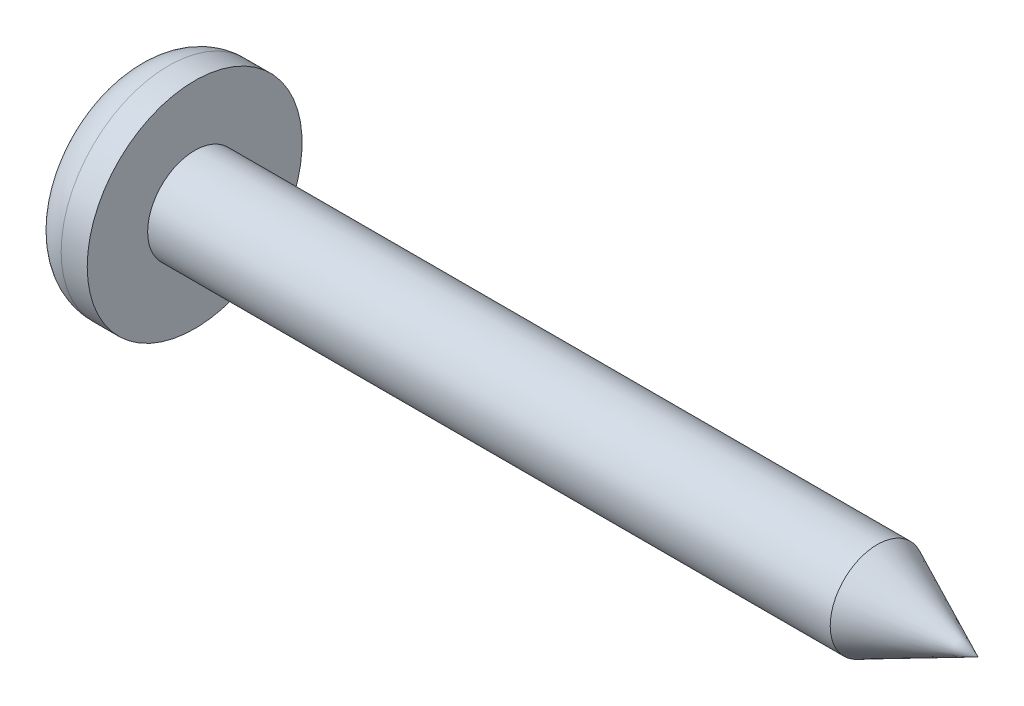
ISO-10303-21;
HEADER;
FILE_DESCRIPTION(('STEP AP214'),'2;1');
FILE_NAME('part.step','',(''),(''),'','','');
FILE_SCHEMA(('AUTOMOTIVE_DESIGN { 1 0 10303 214 1 1 1 1 }'));
ENDSEC;
DATA;
#1=APPLICATION_CONTEXT('core data for automotive mechanical design processes');
#2=APPLICATION_PROTOCOL_DEFINITION('international standard','automotive_design',2000,#1);
#3=PRODUCT_CONTEXT('',#1,'mechanical');
#4=PRODUCT('Part','Part','',(#3));
#5=PRODUCT_RELATED_PRODUCT_CATEGORY('part','',(#4));
#6=PRODUCT_DEFINITION_FORMATION('','',#4);
#7=PRODUCT_DEFINITION_CONTEXT('part definition',#1,'design');
#8=PRODUCT_DEFINITION('design','',#6,#7);
#9=PRODUCT_DEFINITION_SHAPE('','',#8);
#10=(LENGTH_UNIT() NAMED_UNIT(*) SI_UNIT(.MILLI.,.METRE.));
#11=(NAMED_UNIT(*) PLANE_ANGLE_UNIT() SI_UNIT($,.RADIAN.));
#12=(NAMED_UNIT(*) SI_UNIT($,.STERADIAN.) SOLID_ANGLE_UNIT());
#13=UNCERTAINTY_MEASURE_WITH_UNIT(LENGTH_MEASURE(1.E-05),#10,'distance_accuracy_value','');
#14=(GEOMETRIC_REPRESENTATION_CONTEXT(3) GLOBAL_UNCERTAINTY_ASSIGNED_CONTEXT((#13)) GLOBAL_UNIT_ASSIGNED_CONTEXT((#10,
#11,#12)) REPRESENTATION_CONTEXT('',''));
#15=CARTESIAN_POINT('',(0.,0.,0.));
#16=DIRECTION('',(0.,0.,1.));
#17=DIRECTION('',(1.,0.,0.));
#18=AXIS2_PLACEMENT_3D('',#15,#16,#17);
#19=CARTESIAN_POINT('',(0.,0.,0.));
#20=DIRECTION('',(-1.,0.,0.));
#21=DIRECTION('',(0.,0.,1.));
#22=AXIS2_PLACEMENT_3D('',#19,#20,#21);
#23=CYLINDRICAL_SURFACE('',#22,1.5);
#24=CARTESIAN_POINT('',(2.,0.,0.));
#25=DIRECTION('',(-1.,0.,0.));
#26=DIRECTION('',(0.,0.,1.));
#27=AXIS2_PLACEMENT_3D('',#24,#25,#26);
#28=CIRCLE('',#27,1.5);
#29=CARTESIAN_POINT('',(2.,0.,1.5));
#30=VERTEX_POINT('',#29);
#31=EDGE_CURVE('E255',#30,#30,#28,.T.);
#32=ORIENTED_EDGE('',*,*,#31,.F.);
#33=EDGE_LOOP('',(#32));
#34=FACE_BOUND('',#33,.T.);
#35=CARTESIAN_POINT('',(23.7832396192356,0.,0.));
#36=DIRECTION('',(-1.,0.,0.));
#37=DIRECTION('',(0.,0.,1.));
#38=AXIS2_PLACEMENT_3D('',#35,#36,#37);
#39=CIRCLE('',#38,1.5);
#40=CARTESIAN_POINT('',(23.7832396192356,0.,1.5));
#41=VERTEX_POINT('',#40);
#42=EDGE_CURVE('E196',#41,#41,#39,.T.);
#43=ORIENTED_EDGE('',*,*,#42,.T.);
#44=EDGE_LOOP('',(#43));
#45=FACE_BOUND('',#44,.T.);
#46=ADVANCED_FACE('F74',(#34,#45),#23,.T.);
#47=CARTESIAN_POINT('',(0.,0.,0.));
#48=DIRECTION('',(1.,0.,0.));
#49=DIRECTION('',(0.,0.,-1.));
#50=AXIS2_PLACEMENT_3D('',#47,#48,#49);
#51=PLANE('',#50);
#52=CARTESIAN_POINT('',(0.,0.,0.));
#53=DIRECTION('',(-1.,0.,0.));
#54=DIRECTION('',(0.,0.,1.));
#55=AXIS2_PLACEMENT_3D('',#52,#53,#54);
#56=CIRCLE('',#55,2.2606);
#57=CARTESIAN_POINT('',(0.,0.,2.2606));
#58=VERTEX_POINT('',#57);
#59=EDGE_CURVE('E47',#58,#58,#56,.T.);
#60=ORIENTED_EDGE('',*,*,#59,.T.);
#61=EDGE_LOOP('',(#60));
#62=FACE_BOUND('',#61,.T.);
#63=DIRECTION('',(0.,0.,-1.));
#64=VECTOR('',#63,1.);
#65=CARTESIAN_POINT('',(0.,-0.3556,0.3556));
#66=LINE('',#65,#64);
#67=CARTESIAN_POINT('',(0.,-0.3556,2.032));
#68=VERTEX_POINT('',#67);
#69=CARTESIAN_POINT('',(0.,-0.3556,0.762));
#70=VERTEX_POINT('',#69);
#71=EDGE_CURVE('E268',#68,#70,#66,.T.);
#72=ORIENTED_EDGE('',*,*,#71,.T.);
#73=DIRECTION('',(0.,0.707106781186548,0.707106781186547));
#74=VECTOR('',#73,1.);
#75=CARTESIAN_POINT('',(0.,-0.762,0.3556));
#76=LINE('',#75,#74);
#77=CARTESIAN_POINT('',(0.,-0.762,0.3556));
#78=VERTEX_POINT('',#77);
#79=EDGE_CURVE('E198',#78,#70,#76,.T.);
#80=ORIENTED_EDGE('',*,*,#79,.F.);
#81=DIRECTION('',(0.,-1.,0.));
#82=VECTOR('',#81,1.);
#83=CARTESIAN_POINT('',(0.,-0.3556,0.3556));
#84=LINE('',#83,#82);
#85=CARTESIAN_POINT('',(0.,-2.032,0.3556));
#86=VERTEX_POINT('',#85);
#87=EDGE_CURVE('E271',#78,#86,#84,.T.);
#88=ORIENTED_EDGE('',*,*,#87,.T.);
#89=DIRECTION('',(0.,0.,-1.));
#90=VECTOR('',#89,1.);
#91=CARTESIAN_POINT('',(0.,-2.032,-0.3556));
#92=LINE('',#91,#90);
#93=CARTESIAN_POINT('',(0.,-2.032,-0.3556));
#94=VERTEX_POINT('',#93);
#95=EDGE_CURVE('E273',#86,#94,#92,.T.);
#96=ORIENTED_EDGE('',*,*,#95,.T.);
#97=DIRECTION('',(0.,1.,0.));
#98=VECTOR('',#97,1.);
#99=CARTESIAN_POINT('',(0.,-0.3556,-0.3556));
#100=LINE('',#99,#98);
#101=CARTESIAN_POINT('',(0.,-0.762,-0.3556));
#102=VERTEX_POINT('',#101);
#103=EDGE_CURVE('E276',#94,#102,#100,.T.);
#104=ORIENTED_EDGE('',*,*,#103,.T.);
#105=DIRECTION('',(0.,-0.707106781186548,0.707106781186547));
#106=VECTOR('',#105,1.);
#107=CARTESIAN_POINT('',(0.,-0.762,-0.3556));
#108=LINE('',#107,#106);
#109=CARTESIAN_POINT('',(0.,-0.3556,-0.762));
#110=VERTEX_POINT('',#109);
#111=EDGE_CURVE('E208',#110,#102,#108,.T.);
#112=ORIENTED_EDGE('',*,*,#111,.F.);
#113=DIRECTION('',(0.,0.,-1.));
#114=VECTOR('',#113,1.);
#115=CARTESIAN_POINT('',(0.,-0.3556,-2.032));
#116=LINE('',#115,#114);
#117=CARTESIAN_POINT('',(0.,-0.3556,-2.032));
#118=VERTEX_POINT('',#117);
#119=EDGE_CURVE('E279',#110,#118,#116,.T.);
#120=ORIENTED_EDGE('',*,*,#119,.T.);
#121=DIRECTION('',(0.,1.,0.));
#122=VECTOR('',#121,1.);
#123=CARTESIAN_POINT('',(0.,0.3556,-2.032));
#124=LINE('',#123,#122);
#125=CARTESIAN_POINT('',(0.,0.3556,-2.032));
#126=VERTEX_POINT('',#125);
#127=EDGE_CURVE('E281',#118,#126,#124,.T.);
#128=ORIENTED_EDGE('',*,*,#127,.T.);
#129=DIRECTION('',(0.,0.,1.));
#130=VECTOR('',#129,1.);
#131=CARTESIAN_POINT('',(0.,0.3556,-2.032));
#132=LINE('',#131,#130);
#133=CARTESIAN_POINT('',(0.,0.3556,-0.762));
#134=VERTEX_POINT('',#133);
#135=EDGE_CURVE('E284',#126,#134,#132,.T.);
#136=ORIENTED_EDGE('',*,*,#135,.T.);
#137=DIRECTION('',(0.,-0.707106781186548,-0.707106781186547));
#138=VECTOR('',#137,1.);
#139=CARTESIAN_POINT('',(0.,0.762,-0.3556));
#140=LINE('',#139,#138);
#141=CARTESIAN_POINT('',(0.,0.762,-0.3556));
#142=VERTEX_POINT('',#141);
#143=EDGE_CURVE('E211',#142,#134,#140,.T.);
#144=ORIENTED_EDGE('',*,*,#143,.F.);
#145=DIRECTION('',(0.,1.,0.));
#146=VECTOR('',#145,1.);
#147=CARTESIAN_POINT('',(0.,2.032,-0.3556));
#148=LINE('',#147,#146);
#149=CARTESIAN_POINT('',(0.,2.032,-0.3556));
#150=VERTEX_POINT('',#149);
#151=EDGE_CURVE('E228',#142,#150,#148,.T.);
#152=ORIENTED_EDGE('',*,*,#151,.T.);
#153=DIRECTION('',(0.,0.,1.));
#154=VECTOR('',#153,1.);
#155=CARTESIAN_POINT('',(0.,2.032,-0.3556));
#156=LINE('',#155,#154);
#157=CARTESIAN_POINT('',(0.,2.032,0.3556));
#158=VERTEX_POINT('',#157);
#159=EDGE_CURVE('E257',#150,#158,#156,.T.);
#160=ORIENTED_EDGE('',*,*,#159,.T.);
#161=DIRECTION('',(0.,-1.,0.));
#162=VECTOR('',#161,1.);
#163=CARTESIAN_POINT('',(0.,2.032,0.3556));
#164=LINE('',#163,#162);
#165=CARTESIAN_POINT('',(0.,0.762,0.3556));
#166=VERTEX_POINT('',#165);
#167=EDGE_CURVE('E260',#158,#166,#164,.T.);
#168=ORIENTED_EDGE('',*,*,#167,.T.);
#169=DIRECTION('',(0.,0.707106781186548,-0.707106781186547));
#170=VECTOR('',#169,1.);
#171=CARTESIAN_POINT('',(0.,0.762,0.3556));
#172=LINE('',#171,#170);
#173=CARTESIAN_POINT('',(0.,0.3556,0.762));
#174=VERTEX_POINT('',#173);
#175=EDGE_CURVE('E225',#174,#166,#172,.T.);
#176=ORIENTED_EDGE('',*,*,#175,.F.);
#177=DIRECTION('',(0.,0.,1.));
#178=VECTOR('',#177,1.);
#179=CARTESIAN_POINT('',(0.,0.3556,0.3556));
#180=LINE('',#179,#178);
#181=CARTESIAN_POINT('',(0.,0.3556,2.032));
#182=VERTEX_POINT('',#181);
#183=EDGE_CURVE('E263',#174,#182,#180,.T.);
#184=ORIENTED_EDGE('',*,*,#183,.T.);
#185=DIRECTION('',(0.,-1.,0.));
#186=VECTOR('',#185,1.);
#187=CARTESIAN_POINT('',(0.,0.3556,2.032));
#188=LINE('',#187,#186);
#189=EDGE_CURVE('E265',#182,#68,#188,.T.);
#190=ORIENTED_EDGE('',*,*,#189,.T.);
#191=EDGE_LOOP('',(#72,#80,#88,#96,#104,#112,#120,#128,#136,#144,#152,#160,#168,#176,#184,#190));
#192=FACE_BOUND('',#191,.T.);
#193=ADVANCED_FACE('F334',(#62,#192),#51,.F.);
#194=CARTESIAN_POINT('',(1.1684,0.,0.));
#195=DIRECTION('',(-1.,0.,0.));
#196=DIRECTION('',(0.,0.,1.));
#197=AXIS2_PLACEMENT_3D('',#194,#195,#196);
#198=TOROIDAL_SURFACE('',#197,2.2606,1.1684);
#199=ORIENTED_EDGE('',*,*,#59,.F.);
#200=EDGE_LOOP('',(#199));
#201=FACE_BOUND('',#200,.T.);
#202=CARTESIAN_POINT('',(1.1684,0.,0.));
#203=DIRECTION('',(-1.,0.,0.));
#204=DIRECTION('',(0.,0.,1.));
#205=AXIS2_PLACEMENT_3D('',#202,#203,#204);
#206=CIRCLE('',#205,3.429);
#207=CARTESIAN_POINT('',(1.1684,0.,3.429));
#208=VERTEX_POINT('',#207);
#209=EDGE_CURVE('E83',#208,#208,#206,.T.);
#210=ORIENTED_EDGE('',*,*,#209,.T.);
#211=EDGE_LOOP('',(#210));
#212=FACE_BOUND('',#211,.T.);
#213=ADVANCED_FACE('F405',(#201,#212),#198,.T.);
#214=CARTESIAN_POINT('',(0.,0.,0.));
#215=DIRECTION('',(-1.,0.,0.));
#216=DIRECTION('',(0.,0.,1.));
#217=AXIS2_PLACEMENT_3D('',#214,#215,#216);
#218=CYLINDRICAL_SURFACE('',#217,3.429);
#219=ORIENTED_EDGE('',*,*,#209,.F.);
#220=EDGE_LOOP('',(#219));
#221=FACE_BOUND('',#220,.T.);
#222=CARTESIAN_POINT('',(2.,0.,0.));
#223=DIRECTION('',(-1.,0.,0.));
#224=DIRECTION('',(0.,0.,1.));
#225=AXIS2_PLACEMENT_3D('',#222,#223,#224);
#226=CIRCLE('',#225,3.429);
#227=CARTESIAN_POINT('',(2.,0.,3.429));
#228=VERTEX_POINT('',#227);
#229=EDGE_CURVE('E293',#228,#228,#226,.T.);
#230=ORIENTED_EDGE('',*,*,#229,.T.);
#231=EDGE_LOOP('',(#230));
#232=FACE_BOUND('',#231,.T.);
#233=ADVANCED_FACE('F415',(#221,#232),#218,.T.);
#234=CARTESIAN_POINT('',(2.,1.5,0.));
#235=DIRECTION('',(-1.,0.,0.));
#236=DIRECTION('',(0.,0.,1.));
#237=AXIS2_PLACEMENT_3D('',#234,#235,#236);
#238=PLANE('',#237);
#239=ORIENTED_EDGE('',*,*,#229,.F.);
#240=EDGE_LOOP('',(#239));
#241=FACE_BOUND('',#240,.T.);
#242=ORIENTED_EDGE('',*,*,#31,.T.);
#243=EDGE_LOOP('',(#242));
#244=FACE_BOUND('',#243,.T.);
#245=ADVANCED_FACE('F412',(#241,#244),#238,.F.);
#246=CARTESIAN_POINT('',(7.74736391748426,0.3556,-2.032));
#247=DIRECTION('',(0.,-1.,0.));
#248=DIRECTION('',(0.,0.,-1.));
#249=AXIS2_PLACEMENT_3D('',#246,#247,#248);
#250=PLANE('',#249);
#251=DIRECTION('',(-1.,0.,0.));
#252=VECTOR('',#251,1.);
#253=CARTESIAN_POINT('',(2.54933639174843,0.3556,-0.762));
#254=LINE('',#253,#252);
#255=CARTESIAN_POINT('',(1.9746,0.3556,-0.761999999999999));
#256=VERTEX_POINT('',#255);
#257=EDGE_CURVE('E220',#256,#134,#254,.T.);
#258=ORIENTED_EDGE('',*,*,#257,.T.);
#259=ORIENTED_EDGE('',*,*,#135,.F.);
#260=DIRECTION('',(-0.939692620785908,0.,-0.342020143325669));
#261=VECTOR('',#260,1.);
#262=CARTESIAN_POINT('',(6.84109449764677,0.3556,0.457954766945729));
#263=LINE('',#262,#261);
#264=CARTESIAN_POINT('',(1.9746,0.3556,-1.31330437541795));
#265=VERTEX_POINT('',#264);
#266=EDGE_CURVE('E287',#265,#126,#263,.T.);
#267=ORIENTED_EDGE('',*,*,#266,.F.);
#268=DIRECTION('',(0.,0.,-1.));
#269=VECTOR('',#268,1.);
#270=CARTESIAN_POINT('',(1.9746,0.3556,-2.032));
#271=LINE('',#270,#269);
#272=EDGE_CURVE('E288',#256,#265,#271,.T.);
#273=ORIENTED_EDGE('',*,*,#272,.F.);
#274=EDGE_LOOP('',(#258,#259,#267,#273));
#275=FACE_BOUND('',#274,.T.);
#276=ADVANCED_FACE('F379',(#275),#250,.T.);
#277=CARTESIAN_POINT('',(0.,0.3556,-2.032));
#278=DIRECTION('',(-0.342020143325669,0.,0.939692620785908));
#279=DIRECTION('',(0.939692620785908,0.,0.342020143325669));
#280=AXIS2_PLACEMENT_3D('',#277,#278,#279);
#281=PLANE('',#280);
#282=ORIENTED_EDGE('',*,*,#266,.T.);
#283=ORIENTED_EDGE('',*,*,#127,.F.);
#284=DIRECTION('',(-0.939692620785908,0.,-0.342020143325669));
#285=VECTOR('',#284,1.);
#286=CARTESIAN_POINT('',(0.,-0.3556,-2.032));
#287=LINE('',#286,#285);
#288=CARTESIAN_POINT('',(1.9746,-0.3556,-1.31330437541795));
#289=VERTEX_POINT('',#288);
#290=EDGE_CURVE('E299',#289,#118,#287,.T.);
#291=ORIENTED_EDGE('',*,*,#290,.F.);
#292=DIRECTION('',(0.,-1.,0.));
#293=VECTOR('',#292,1.);
#294=CARTESIAN_POINT('',(1.9746,0.3556,-1.31330437541796));
#295=LINE('',#294,#293);
#296=EDGE_CURVE('E239',#265,#289,#295,.T.);
#297=ORIENTED_EDGE('',*,*,#296,.F.);
#298=EDGE_LOOP('',(#282,#283,#291,#297));
#299=FACE_BOUND('',#298,.T.);
#300=ADVANCED_FACE('F384',(#299),#281,.T.);
#301=CARTESIAN_POINT('',(7.74736391748426,-0.3556,-2.032));
#302=DIRECTION('',(0.,1.,0.));
#303=DIRECTION('',(0.,0.,1.));
#304=AXIS2_PLACEMENT_3D('',#301,#302,#303);
#305=PLANE('',#304);
#306=DIRECTION('',(-1.,0.,0.));
#307=VECTOR('',#306,1.);
#308=CARTESIAN_POINT('',(2.54933639174843,-0.3556,-0.762));
#309=LINE('',#308,#307);
#310=CARTESIAN_POINT('',(1.9746,-0.3556,-0.762));
#311=VERTEX_POINT('',#310);
#312=EDGE_CURVE('E214',#311,#110,#309,.T.);
#313=ORIENTED_EDGE('',*,*,#312,.F.);
#314=DIRECTION('',(0.,0.,1.));
#315=VECTOR('',#314,1.);
#316=CARTESIAN_POINT('',(1.9746,-0.3556,-2.032));
#317=LINE('',#316,#315);
#318=EDGE_CURVE('E235',#289,#311,#317,.T.);
#319=ORIENTED_EDGE('',*,*,#318,.F.);
#320=ORIENTED_EDGE('',*,*,#290,.T.);
#321=ORIENTED_EDGE('',*,*,#119,.F.);
#322=EDGE_LOOP('',(#313,#319,#320,#321));
#323=FACE_BOUND('',#322,.T.);
#324=ADVANCED_FACE('F388',(#323),#305,.T.);
#325=CARTESIAN_POINT('',(7.74736391748426,-0.3556,-0.3556));
#326=DIRECTION('',(0.,0.,1.));
#327=DIRECTION('',(1.,0.,0.));
#328=AXIS2_PLACEMENT_3D('',#325,#326,#327);
#329=PLANE('',#328);
#330=DIRECTION('',(-1.,0.,0.));
#331=VECTOR('',#330,1.);
#332=CARTESIAN_POINT('',(2.54933639174843,-0.762,-0.3556));
#333=LINE('',#332,#331);
#334=CARTESIAN_POINT('',(1.9746,-0.762,-0.3556));
#335=VERTEX_POINT('',#334);
#336=EDGE_CURVE('E212',#335,#102,#333,.T.);
#337=ORIENTED_EDGE('',*,*,#336,.T.);
#338=ORIENTED_EDGE('',*,*,#103,.F.);
#339=DIRECTION('',(-0.939692620785908,-0.342020143325669,0.));
#340=VECTOR('',#339,1.);
#341=CARTESIAN_POINT('',(7.37987907208603,0.654056314723403,-0.3556));
#342=LINE('',#341,#340);
#343=CARTESIAN_POINT('',(1.9746,-1.31330437541795,-0.3556));
#344=VERTEX_POINT('',#343);
#345=EDGE_CURVE('E304',#344,#94,#342,.T.);
#346=ORIENTED_EDGE('',*,*,#345,.F.);
#347=DIRECTION('',(0.,-1.,0.));
#348=VECTOR('',#347,1.);
#349=CARTESIAN_POINT('',(1.9746,-0.3556,-0.3556));
#350=LINE('',#349,#348);
#351=EDGE_CURVE('E238',#335,#344,#350,.T.);
#352=ORIENTED_EDGE('',*,*,#351,.F.);
#353=EDGE_LOOP('',(#337,#338,#346,#352));
#354=FACE_BOUND('',#353,.T.);
#355=ADVANCED_FACE('F330',(#354),#329,.T.);
#356=CARTESIAN_POINT('',(0.,-2.032,-0.3556));
#357=DIRECTION('',(-0.342020143325669,0.939692620785908,0.));
#358=DIRECTION('',(-0.939692620785908,-0.342020143325669,0.));
#359=AXIS2_PLACEMENT_3D('',#356,#357,#358);
#360=PLANE('',#359);
#361=ORIENTED_EDGE('',*,*,#345,.T.);
#362=ORIENTED_EDGE('',*,*,#95,.F.);
#363=DIRECTION('',(-0.939692620785908,-0.342020143325669,0.));
#364=VECTOR('',#363,1.);
#365=CARTESIAN_POINT('',(0.,-2.032,0.3556));
#366=LINE('',#365,#364);
#367=CARTESIAN_POINT('',(1.9746,-1.31330437541795,0.3556));
#368=VERTEX_POINT('',#367);
#369=EDGE_CURVE('E78',#368,#86,#366,.T.);
#370=ORIENTED_EDGE('',*,*,#369,.F.);
#371=DIRECTION('',(0.,0.,1.));
#372=VECTOR('',#371,1.);
#373=CARTESIAN_POINT('',(1.9746,-1.31330437541796,-0.3556));
#374=LINE('',#373,#372);
#375=EDGE_CURVE('E241',#344,#368,#374,.T.);
#376=ORIENTED_EDGE('',*,*,#375,.F.);
#377=EDGE_LOOP('',(#361,#362,#370,#376));
#378=FACE_BOUND('',#377,.T.);
#379=ADVANCED_FACE('F325',(#378),#360,.T.);
#380=CARTESIAN_POINT('',(7.74736391748426,-0.3556,0.3556));
#381=DIRECTION('',(0.,0.,-1.));
#382=DIRECTION('',(0.,1.,0.));
#383=AXIS2_PLACEMENT_3D('',#380,#381,#382);
#384=PLANE('',#383);
#385=DIRECTION('',(-1.,0.,0.));
#386=VECTOR('',#385,1.);
#387=CARTESIAN_POINT('',(2.54933639174843,-0.762,0.3556));
#388=LINE('',#387,#386);
#389=CARTESIAN_POINT('',(1.9746,-0.762,0.3556));
#390=VERTEX_POINT('',#389);
#391=EDGE_CURVE('E200',#390,#78,#388,.T.);
#392=ORIENTED_EDGE('',*,*,#391,.F.);
#393=DIRECTION('',(0.,1.,0.));
#394=VECTOR('',#393,1.);
#395=CARTESIAN_POINT('',(1.9746,-0.3556,0.3556));
#396=LINE('',#395,#394);
#397=EDGE_CURVE('E242',#368,#390,#396,.T.);
#398=ORIENTED_EDGE('',*,*,#397,.F.);
#399=ORIENTED_EDGE('',*,*,#369,.T.);
#400=ORIENTED_EDGE('',*,*,#87,.F.);
#401=EDGE_LOOP('',(#392,#398,#399,#400));
#402=FACE_BOUND('',#401,.T.);
#403=ADVANCED_FACE('F339',(#402),#384,.T.);
#404=CARTESIAN_POINT('',(7.74736391748426,-0.3556,0.3556));
#405=DIRECTION('',(0.,1.,0.));
#406=DIRECTION('',(0.,0.,1.));
#407=AXIS2_PLACEMENT_3D('',#404,#405,#406);
#408=PLANE('',#407);
#409=DIRECTION('',(-1.,0.,0.));
#410=VECTOR('',#409,1.);
#411=CARTESIAN_POINT('',(2.54933639174843,-0.3556,0.762));
#412=LINE('',#411,#410);
#413=CARTESIAN_POINT('',(1.9746,-0.3556,0.761999999999999));
#414=VERTEX_POINT('',#413);
#415=EDGE_CURVE('E203',#414,#70,#412,.T.);
#416=ORIENTED_EDGE('',*,*,#415,.T.);
#417=ORIENTED_EDGE('',*,*,#71,.F.);
#418=DIRECTION('',(-0.939692620785908,0.,0.342020143325669));
#419=VECTOR('',#418,1.);
#420=CARTESIAN_POINT('',(7.37987907208603,-0.3556,-0.654056314723402));
#421=LINE('',#420,#419);
#422=CARTESIAN_POINT('',(1.9746,-0.3556,1.31330437541796));
#423=VERTEX_POINT('',#422);
#424=EDGE_CURVE('E312',#423,#68,#421,.T.);
#425=ORIENTED_EDGE('',*,*,#424,.F.);
#426=DIRECTION('',(0.,0.,1.));
#427=VECTOR('',#426,1.);
#428=CARTESIAN_POINT('',(1.9746,-0.3556,0.3556));
#429=LINE('',#428,#427);
#430=EDGE_CURVE('E244',#414,#423,#429,.T.);
#431=ORIENTED_EDGE('',*,*,#430,.F.);
#432=EDGE_LOOP('',(#416,#417,#425,#431));
#433=FACE_BOUND('',#432,.T.);
#434=ADVANCED_FACE('F345',(#433),#408,.T.);
#435=CARTESIAN_POINT('',(0.,0.3556,2.032));
#436=DIRECTION('',(-0.342020143325669,0.,-0.939692620785908));
#437=DIRECTION('',(-0.939692620785908,0.,0.342020143325669));
#438=AXIS2_PLACEMENT_3D('',#435,#436,#437);
#439=PLANE('',#438);
#440=ORIENTED_EDGE('',*,*,#424,.T.);
#441=ORIENTED_EDGE('',*,*,#189,.F.);
#442=DIRECTION('',(-0.939692620785908,0.,0.342020143325669));
#443=VECTOR('',#442,1.);
#444=CARTESIAN_POINT('',(0.,0.3556,2.032));
#445=LINE('',#444,#443);
#446=CARTESIAN_POINT('',(1.9746,0.3556,1.31330437541796));
#447=VERTEX_POINT('',#446);
#448=EDGE_CURVE('E307',#447,#182,#445,.T.);
#449=ORIENTED_EDGE('',*,*,#448,.F.);
#450=DIRECTION('',(0.,1.,0.));
#451=VECTOR('',#450,1.);
#452=CARTESIAN_POINT('',(1.9746,0.3556,1.31330437541796));
#453=LINE('',#452,#451);
#454=EDGE_CURVE('E246',#423,#447,#453,.T.);
#455=ORIENTED_EDGE('',*,*,#454,.F.);
#456=EDGE_LOOP('',(#440,#441,#449,#455));
#457=FACE_BOUND('',#456,.T.);
#458=ADVANCED_FACE('F349',(#457),#439,.T.);
#459=CARTESIAN_POINT('',(7.74736391748426,0.3556,0.3556));
#460=DIRECTION('',(0.,-1.,0.));
#461=DIRECTION('',(0.,0.,-1.));
#462=AXIS2_PLACEMENT_3D('',#459,#460,#461);
#463=PLANE('',#462);
#464=DIRECTION('',(-1.,0.,0.));
#465=VECTOR('',#464,1.);
#466=CARTESIAN_POINT('',(2.54933639174843,0.3556,0.762));
#467=LINE('',#466,#465);
#468=CARTESIAN_POINT('',(1.9746,0.3556,0.762));
#469=VERTEX_POINT('',#468);
#470=EDGE_CURVE('E231',#469,#174,#467,.T.);
#471=ORIENTED_EDGE('',*,*,#470,.F.);
#472=DIRECTION('',(0.,0.,-1.));
#473=VECTOR('',#472,1.);
#474=CARTESIAN_POINT('',(1.9746,0.3556,0.3556));
#475=LINE('',#474,#473);
#476=EDGE_CURVE('E247',#447,#469,#475,.T.);
#477=ORIENTED_EDGE('',*,*,#476,.F.);
#478=ORIENTED_EDGE('',*,*,#448,.T.);
#479=ORIENTED_EDGE('',*,*,#183,.F.);
#480=EDGE_LOOP('',(#471,#477,#478,#479));
#481=FACE_BOUND('',#480,.T.);
#482=ADVANCED_FACE('F354',(#481),#463,.T.);
#483=CARTESIAN_POINT('',(7.74736391748426,2.032,0.3556));
#484=DIRECTION('',(0.,0.,-1.));
#485=DIRECTION('',(0.,1.,0.));
#486=AXIS2_PLACEMENT_3D('',#483,#484,#485);
#487=PLANE('',#486);
#488=DIRECTION('',(-1.,0.,0.));
#489=VECTOR('',#488,1.);
#490=CARTESIAN_POINT('',(2.54933639174843,0.762,0.3556));
#491=LINE('',#490,#489);
#492=CARTESIAN_POINT('',(1.9746,0.762,0.3556));
#493=VERTEX_POINT('',#492);
#494=EDGE_CURVE('E229',#493,#166,#491,.T.);
#495=ORIENTED_EDGE('',*,*,#494,.T.);
#496=ORIENTED_EDGE('',*,*,#167,.F.);
#497=DIRECTION('',(-0.939692620785908,0.342020143325669,0.));
#498=VECTOR('',#497,1.);
#499=CARTESIAN_POINT('',(6.84109449764677,-0.457954766945729,0.3556));
#500=LINE('',#499,#498);
#501=CARTESIAN_POINT('',(1.9746,1.31330437541795,0.3556));
#502=VERTEX_POINT('',#501);
#503=EDGE_CURVE('E305',#502,#158,#500,.T.);
#504=ORIENTED_EDGE('',*,*,#503,.F.);
#505=DIRECTION('',(0.,1.,0.));
#506=VECTOR('',#505,1.);
#507=CARTESIAN_POINT('',(1.9746,2.032,0.3556));
#508=LINE('',#507,#506);
#509=EDGE_CURVE('E250',#493,#502,#508,.T.);
#510=ORIENTED_EDGE('',*,*,#509,.F.);
#511=EDGE_LOOP('',(#495,#496,#504,#510));
#512=FACE_BOUND('',#511,.T.);
#513=ADVANCED_FACE('F364',(#512),#487,.T.);
#514=CARTESIAN_POINT('',(0.,2.032,-0.3556));
#515=DIRECTION('',(-0.342020143325669,-0.939692620785908,0.));
#516=DIRECTION('',(0.939692620785908,-0.342020143325669,0.));
#517=AXIS2_PLACEMENT_3D('',#514,#515,#516);
#518=PLANE('',#517);
#519=ORIENTED_EDGE('',*,*,#503,.T.);
#520=ORIENTED_EDGE('',*,*,#159,.F.);
#521=DIRECTION('',(-0.939692620785908,0.342020143325669,0.));
#522=VECTOR('',#521,1.);
#523=CARTESIAN_POINT('',(0.,2.032,-0.3556));
#524=LINE('',#523,#522);
#525=CARTESIAN_POINT('',(1.9746,1.31330437541795,-0.3556));
#526=VERTEX_POINT('',#525);
#527=EDGE_CURVE('E290',#526,#150,#524,.T.);
#528=ORIENTED_EDGE('',*,*,#527,.F.);
#529=DIRECTION('',(0.,0.,-1.));
#530=VECTOR('',#529,1.);
#531=CARTESIAN_POINT('',(1.9746,1.31330437541796,-0.3556));
#532=LINE('',#531,#530);
#533=EDGE_CURVE('E252',#502,#526,#532,.T.);
#534=ORIENTED_EDGE('',*,*,#533,.F.);
#535=EDGE_LOOP('',(#519,#520,#528,#534));
#536=FACE_BOUND('',#535,.T.);
#537=ADVANCED_FACE('F76',(#536),#518,.T.);
#538=CARTESIAN_POINT('',(7.74736391748426,2.032,-0.3556));
#539=DIRECTION('',(0.,0.,1.));
#540=DIRECTION('',(1.,0.,0.));
#541=AXIS2_PLACEMENT_3D('',#538,#539,#540);
#542=PLANE('',#541);
#543=DIRECTION('',(-1.,0.,0.));
#544=VECTOR('',#543,1.);
#545=CARTESIAN_POINT('',(2.54933639174843,0.762,-0.3556));
#546=LINE('',#545,#544);
#547=CARTESIAN_POINT('',(1.9746,0.762,-0.3556));
#548=VERTEX_POINT('',#547);
#549=EDGE_CURVE('E219',#548,#142,#546,.T.);
#550=ORIENTED_EDGE('',*,*,#549,.F.);
#551=DIRECTION('',(0.,-1.,0.));
#552=VECTOR('',#551,1.);
#553=CARTESIAN_POINT('',(1.9746,2.032,-0.3556));
#554=LINE('',#553,#552);
#555=EDGE_CURVE('E253',#526,#548,#554,.T.);
#556=ORIENTED_EDGE('',*,*,#555,.F.);
#557=ORIENTED_EDGE('',*,*,#527,.T.);
#558=ORIENTED_EDGE('',*,*,#151,.F.);
#559=EDGE_LOOP('',(#550,#556,#557,#558));
#560=FACE_BOUND('',#559,.T.);
#561=ADVANCED_FACE('F370',(#560),#542,.T.);
#562=CARTESIAN_POINT('',(1.9746,1.5,0.));
#563=DIRECTION('',(-1.,0.,0.));
#564=DIRECTION('',(0.,0.,1.));
#565=AXIS2_PLACEMENT_3D('',#562,#563,#564);
#566=PLANE('',#565);
#567=DIRECTION('',(0.,0.707106781186548,-0.707106781186547));
#568=VECTOR('',#567,1.);
#569=CARTESIAN_POINT('',(1.9746,-0.762,-0.3556));
#570=LINE('',#569,#568);
#571=EDGE_CURVE('E209',#335,#311,#570,.T.);
#572=ORIENTED_EDGE('',*,*,#571,.F.);
#573=ORIENTED_EDGE('',*,*,#351,.T.);
#574=ORIENTED_EDGE('',*,*,#375,.T.);
#575=ORIENTED_EDGE('',*,*,#397,.T.);
#576=DIRECTION('',(0.,-0.707106781186548,-0.707106781186547));
#577=VECTOR('',#576,1.);
#578=CARTESIAN_POINT('',(1.9746,-0.762,0.3556));
#579=LINE('',#578,#577);
#580=EDGE_CURVE('E91',#414,#390,#579,.T.);
#581=ORIENTED_EDGE('',*,*,#580,.F.);
#582=ORIENTED_EDGE('',*,*,#430,.T.);
#583=ORIENTED_EDGE('',*,*,#454,.T.);
#584=ORIENTED_EDGE('',*,*,#476,.T.);
#585=DIRECTION('',(0.,-0.707106781186548,0.707106781186547));
#586=VECTOR('',#585,1.);
#587=CARTESIAN_POINT('',(1.9746,0.762,0.3556));
#588=LINE('',#587,#586);
#589=EDGE_CURVE('E226',#493,#469,#588,.T.);
#590=ORIENTED_EDGE('',*,*,#589,.F.);
#591=ORIENTED_EDGE('',*,*,#509,.T.);
#592=ORIENTED_EDGE('',*,*,#533,.T.);
#593=ORIENTED_EDGE('',*,*,#555,.T.);
#594=DIRECTION('',(0.,0.707106781186548,0.707106781186547));
#595=VECTOR('',#594,1.);
#596=CARTESIAN_POINT('',(1.9746,0.762,-0.3556));
#597=LINE('',#596,#595);
#598=EDGE_CURVE('E98',#256,#548,#597,.T.);
#599=ORIENTED_EDGE('',*,*,#598,.F.);
#600=ORIENTED_EDGE('',*,*,#272,.T.);
#601=ORIENTED_EDGE('',*,*,#296,.T.);
#602=ORIENTED_EDGE('',*,*,#318,.T.);
#603=EDGE_LOOP('',(#572,#573,#574,#575,#581,#582,#583,#584,#590,#591,#592,#593,#599,#600,#601,#602));
#604=FACE_BOUND('',#603,.T.);
#605=ADVANCED_FACE('F320',(#604),#566,.T.);
#606=CARTESIAN_POINT('',(2.54933639174843,0.762,0.3556));
#607=DIRECTION('',(0.,0.707106781186547,0.707106781186548));
#608=DIRECTION('',(0.,-0.707106781186548,0.707106781186547));
#609=AXIS2_PLACEMENT_3D('',#606,#607,#608);
#610=PLANE('',#609);
#611=ORIENTED_EDGE('',*,*,#589,.T.);
#612=ORIENTED_EDGE('',*,*,#470,.T.);
#613=ORIENTED_EDGE('',*,*,#175,.T.);
#614=ORIENTED_EDGE('',*,*,#494,.F.);
#615=EDGE_LOOP('',(#611,#612,#613,#614));
#616=FACE_BOUND('',#615,.T.);
#617=ADVANCED_FACE('F359',(#616),#610,.F.);
#618=CARTESIAN_POINT('',(2.54933639174843,0.762,-0.3556));
#619=DIRECTION('',(0.,0.707106781186547,-0.707106781186548));
#620=DIRECTION('',(0.,0.707106781186548,0.707106781186547));
#621=AXIS2_PLACEMENT_3D('',#618,#619,#620);
#622=PLANE('',#621);
#623=ORIENTED_EDGE('',*,*,#598,.T.);
#624=ORIENTED_EDGE('',*,*,#549,.T.);
#625=ORIENTED_EDGE('',*,*,#143,.T.);
#626=ORIENTED_EDGE('',*,*,#257,.F.);
#627=EDGE_LOOP('',(#623,#624,#625,#626));
#628=FACE_BOUND('',#627,.T.);
#629=ADVANCED_FACE('F374',(#628),#622,.F.);
#630=CARTESIAN_POINT('',(2.54933639174843,-0.762,-0.3556));
#631=DIRECTION('',(0.,-0.707106781186547,-0.707106781186548));
#632=DIRECTION('',(0.,0.707106781186548,-0.707106781186547));
#633=AXIS2_PLACEMENT_3D('',#630,#631,#632);
#634=PLANE('',#633);
#635=ORIENTED_EDGE('',*,*,#571,.T.);
#636=ORIENTED_EDGE('',*,*,#312,.T.);
#637=ORIENTED_EDGE('',*,*,#111,.T.);
#638=ORIENTED_EDGE('',*,*,#336,.F.);
#639=EDGE_LOOP('',(#635,#636,#637,#638));
#640=FACE_BOUND('',#639,.T.);
#641=ADVANCED_FACE('F390',(#640),#634,.F.);
#642=CARTESIAN_POINT('',(2.54933639174843,-0.762,0.3556));
#643=DIRECTION('',(0.,-0.707106781186547,0.707106781186548));
#644=DIRECTION('',(0.,-0.707106781186548,-0.707106781186547));
#645=AXIS2_PLACEMENT_3D('',#642,#643,#644);
#646=PLANE('',#645);
#647=ORIENTED_EDGE('',*,*,#580,.T.);
#648=ORIENTED_EDGE('',*,*,#391,.T.);
#649=ORIENTED_EDGE('',*,*,#79,.T.);
#650=ORIENTED_EDGE('',*,*,#415,.F.);
#651=EDGE_LOOP('',(#647,#648,#649,#650));
#652=FACE_BOUND('',#651,.T.);
#653=ADVANCED_FACE('F192',(#652),#646,.F.);
#654=CARTESIAN_POINT('',(23.7832396192356,0.,0.));
#655=DIRECTION('',(-1.,0.,0.));
#656=DIRECTION('',(0.,0.,1.));
#657=AXIS2_PLACEMENT_3D('',#654,#655,#656);
#658=CONICAL_SURFACE('',#657,1.5,0.436332312998576);
#659=CARTESIAN_POINT('',(27.,0.,0.));
#660=VERTEX_POINT('',#659);
#661=VERTEX_LOOP('',#660);
#662=FACE_BOUND('',#661,.T.);
#663=ORIENTED_EDGE('',*,*,#42,.F.);
#664=EDGE_LOOP('',(#663));
#665=FACE_BOUND('',#664,.T.);
#666=ADVANCED_FACE('F189',(#662,#665),#658,.T.);
#667=CLOSED_SHELL('',(#46,#193,#213,#233,#245,#276,#300,#324,#355,#379,#403,#434,#458,#482,#513,
#537,#561,#605,#617,#629,#641,#653,#666));
#668=MANIFOLD_SOLID_BREP('B6',#667);
#669=ADVANCED_BREP_SHAPE_REPRESENTATION('',(#18,#668),#14);
#670=SHAPE_DEFINITION_REPRESENTATION(#9,#669);
ENDSEC;
END-ISO-10303-21;
